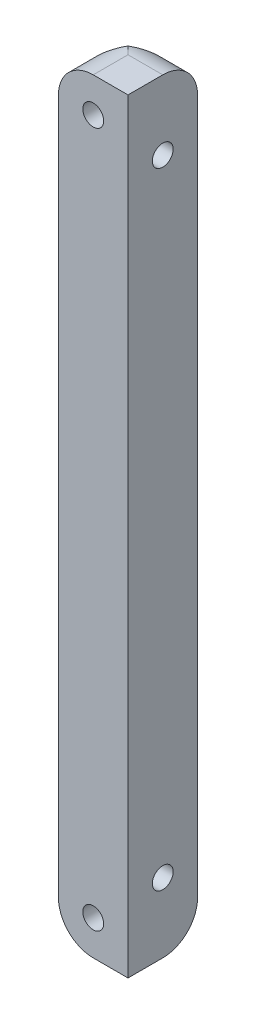
ISO-10303-21;
HEADER;
FILE_DESCRIPTION(('STEP AP214'),'2;1');
FILE_NAME('part.step','',(''),(''),'','','');
FILE_SCHEMA(('AUTOMOTIVE_DESIGN { 1 0 10303 214 1 1 1 1 }'));
ENDSEC;
DATA;
#1=APPLICATION_CONTEXT('core data for automotive mechanical design processes');
#2=APPLICATION_PROTOCOL_DEFINITION('international standard','automotive_design',2000,#1);
#3=PRODUCT_CONTEXT('',#1,'mechanical');
#4=PRODUCT('Part','Part','',(#3));
#5=PRODUCT_RELATED_PRODUCT_CATEGORY('part','',(#4));
#6=PRODUCT_DEFINITION_FORMATION('','',#4);
#7=PRODUCT_DEFINITION_CONTEXT('part definition',#1,'design');
#8=PRODUCT_DEFINITION('design','',#6,#7);
#9=PRODUCT_DEFINITION_SHAPE('','',#8);
#10=(LENGTH_UNIT() NAMED_UNIT(*) SI_UNIT(.MILLI.,.METRE.));
#11=(NAMED_UNIT(*) PLANE_ANGLE_UNIT() SI_UNIT($,.RADIAN.));
#12=(NAMED_UNIT(*) SI_UNIT($,.STERADIAN.) SOLID_ANGLE_UNIT());
#13=UNCERTAINTY_MEASURE_WITH_UNIT(LENGTH_MEASURE(1.E-05),#10,'distance_accuracy_value','');
#14=(GEOMETRIC_REPRESENTATION_CONTEXT(3) GLOBAL_UNCERTAINTY_ASSIGNED_CONTEXT((#13)) GLOBAL_UNIT_ASSIGNED_CONTEXT((#10,
#11,#12)) REPRESENTATION_CONTEXT('',''));
#15=CARTESIAN_POINT('',(0.,0.,0.));
#16=DIRECTION('',(0.,0.,1.));
#17=DIRECTION('',(1.,0.,0.));
#18=AXIS2_PLACEMENT_3D('',#15,#16,#17);
#19=CARTESIAN_POINT('',(0.,0.,12.7));
#20=DIRECTION('',(1.,0.,0.));
#21=DIRECTION('',(0.,0.,-1.));
#22=AXIS2_PLACEMENT_3D('',#19,#20,#21);
#23=PLANE('',#22);
#24=DIRECTION('',(0.,-1.,0.));
#25=VECTOR('',#24,1.);
#26=CARTESIAN_POINT('',(0.,0.,9.52500000000001));
#27=LINE('',#26,#25);
#28=CARTESIAN_POINT('',(0.,133.35,9.52500000000001));
#29=VERTEX_POINT('',#28);
#30=CARTESIAN_POINT('',(0.,6.35,9.52500000000001));
#31=VERTEX_POINT('',#30);
#32=EDGE_CURVE('E163',#29,#31,#27,.T.);
#33=ORIENTED_EDGE('',*,*,#32,.T.);
#34=DIRECTION('',(0.,0.,-1.));
#35=VECTOR('',#34,1.);
#36=CARTESIAN_POINT('',(0.,6.35,12.7));
#37=LINE('',#36,#35);
#38=CARTESIAN_POINT('',(0.,6.35,12.7));
#39=VERTEX_POINT('',#38);
#40=EDGE_CURVE('E226',#31,#39,#37,.F.);
#41=ORIENTED_EDGE('',*,*,#40,.T.);
#42=DIRECTION('',(0.,-1.,0.));
#43=VECTOR('',#42,1.);
#44=CARTESIAN_POINT('',(0.,0.,12.7));
#45=LINE('',#44,#43);
#46=CARTESIAN_POINT('',(0.,133.35,12.7));
#47=VERTEX_POINT('',#46);
#48=EDGE_CURVE('E154',#47,#39,#45,.T.);
#49=ORIENTED_EDGE('',*,*,#48,.F.);
#50=DIRECTION('',(0.,0.,-1.));
#51=VECTOR('',#50,1.);
#52=CARTESIAN_POINT('',(0.,133.35,12.7));
#53=LINE('',#52,#51);
#54=EDGE_CURVE('E223',#47,#29,#53,.T.);
#55=ORIENTED_EDGE('',*,*,#54,.T.);
#56=EDGE_LOOP('',(#33,#41,#49,#55));
#57=FACE_BOUND('',#56,.T.);
#58=ADVANCED_FACE('F47',(#57),#23,.F.);
#59=CARTESIAN_POINT('',(0.,0.,12.7));
#60=DIRECTION('',(0.,1.,0.));
#61=DIRECTION('',(0.,0.,1.));
#62=AXIS2_PLACEMENT_3D('',#59,#60,#61);
#63=PLANE('',#62);
#64=DIRECTION('',(1.,0.,0.));
#65=VECTOR('',#64,1.);
#66=CARTESIAN_POINT('',(0.,0.,12.7));
#67=LINE('',#66,#65);
#68=CARTESIAN_POINT('',(6.35,0.,12.7));
#69=VERTEX_POINT('',#68);
#70=CARTESIAN_POINT('',(12.7,0.,12.7));
#71=VERTEX_POINT('',#70);
#72=EDGE_CURVE('E141',#69,#71,#67,.T.);
#73=ORIENTED_EDGE('',*,*,#72,.F.);
#74=DIRECTION('',(0.,0.,-1.));
#75=VECTOR('',#74,1.);
#76=CARTESIAN_POINT('',(6.35,0.,12.7));
#77=LINE('',#76,#75);
#78=CARTESIAN_POINT('',(6.35,0.,6.35));
#79=VERTEX_POINT('',#78);
#80=EDGE_CURVE('E208',#69,#79,#77,.T.);
#81=ORIENTED_EDGE('',*,*,#80,.T.);
#82=DIRECTION('',(1.,0.,0.));
#83=VECTOR('',#82,1.);
#84=CARTESIAN_POINT('',(12.7,0.,6.35));
#85=LINE('',#84,#83);
#86=CARTESIAN_POINT('',(12.7,0.,6.35));
#87=VERTEX_POINT('',#86);
#88=EDGE_CURVE('E160',#79,#87,#85,.T.);
#89=ORIENTED_EDGE('',*,*,#88,.T.);
#90=DIRECTION('',(0.,0.,-1.));
#91=VECTOR('',#90,1.);
#92=CARTESIAN_POINT('',(12.7,0.,12.7));
#93=LINE('',#92,#91);
#94=EDGE_CURVE('E157',#71,#87,#93,.T.);
#95=ORIENTED_EDGE('',*,*,#94,.F.);
#96=EDGE_LOOP('',(#73,#81,#89,#95));
#97=FACE_BOUND('',#96,.T.);
#98=ADVANCED_FACE('F158',(#97),#63,.F.);
#99=CARTESIAN_POINT('',(12.7,0.,12.7));
#100=DIRECTION('',(-1.,0.,0.));
#101=DIRECTION('',(0.,0.,1.));
#102=AXIS2_PLACEMENT_3D('',#99,#100,#101);
#103=PLANE('',#102);
#104=CARTESIAN_POINT('',(12.7,127.,6.35000000000002));
#105=DIRECTION('',(1.,0.,0.));
#106=DIRECTION('',(0.,0.,-1.));
#107=AXIS2_PLACEMENT_3D('',#104,#105,#106);
#108=CIRCLE('',#107,1.905);
#109=CARTESIAN_POINT('',(12.7,127.,4.44500000000002));
#110=VERTEX_POINT('',#109);
#111=EDGE_CURVE('E201',#110,#110,#108,.T.);
#112=ORIENTED_EDGE('',*,*,#111,.F.);
#113=EDGE_LOOP('',(#112));
#114=FACE_BOUND('',#113,.T.);
#115=CARTESIAN_POINT('',(12.7,12.7,6.35000000000002));
#116=DIRECTION('',(1.,0.,0.));
#117=DIRECTION('',(0.,0.,-1.));
#118=AXIS2_PLACEMENT_3D('',#115,#116,#117);
#119=CIRCLE('',#118,1.905);
#120=CARTESIAN_POINT('',(12.7,12.7,4.44500000000002));
#121=VERTEX_POINT('',#120);
#122=EDGE_CURVE('E248',#121,#121,#119,.T.);
#123=ORIENTED_EDGE('',*,*,#122,.F.);
#124=EDGE_LOOP('',(#123));
#125=FACE_BOUND('',#124,.T.);
#126=ORIENTED_EDGE('',*,*,#94,.T.);
#127=CARTESIAN_POINT('',(12.7,6.35,6.35));
#128=DIRECTION('',(-1.,0.,0.));
#129=DIRECTION('',(0.,0.,1.));
#130=AXIS2_PLACEMENT_3D('',#127,#128,#129);
#131=CIRCLE('',#130,6.35);
#132=CARTESIAN_POINT('',(12.7,6.35,0.));
#133=VERTEX_POINT('',#132);
#134=EDGE_CURVE('E236',#87,#133,#131,.F.);
#135=ORIENTED_EDGE('',*,*,#134,.T.);
#136=DIRECTION('',(0.,1.,0.));
#137=VECTOR('',#136,1.);
#138=CARTESIAN_POINT('',(12.7,0.,0.));
#139=LINE('',#138,#137);
#140=CARTESIAN_POINT('',(12.7,133.35,0.));
#141=VERTEX_POINT('',#140);
#142=EDGE_CURVE('E176',#133,#141,#139,.T.);
#143=ORIENTED_EDGE('',*,*,#142,.T.);
#144=CARTESIAN_POINT('',(12.7,133.35,6.35));
#145=DIRECTION('',(-1.,0.,0.));
#146=DIRECTION('',(0.,0.,1.));
#147=AXIS2_PLACEMENT_3D('',#144,#145,#146);
#148=CIRCLE('',#147,6.35);
#149=CARTESIAN_POINT('',(12.7,139.7,6.35));
#150=VERTEX_POINT('',#149);
#151=EDGE_CURVE('E78',#141,#150,#148,.F.);
#152=ORIENTED_EDGE('',*,*,#151,.T.);
#153=DIRECTION('',(0.,0.,-1.));
#154=VECTOR('',#153,1.);
#155=CARTESIAN_POINT('',(12.7,139.7,12.7));
#156=LINE('',#155,#154);
#157=CARTESIAN_POINT('',(12.7,139.7,12.7));
#158=VERTEX_POINT('',#157);
#159=EDGE_CURVE('E164',#158,#150,#156,.T.);
#160=ORIENTED_EDGE('',*,*,#159,.F.);
#161=DIRECTION('',(0.,1.,0.));
#162=VECTOR('',#161,1.);
#163=CARTESIAN_POINT('',(12.7,0.,12.7));
#164=LINE('',#163,#162);
#165=EDGE_CURVE('E147',#71,#158,#164,.T.);
#166=ORIENTED_EDGE('',*,*,#165,.F.);
#167=EDGE_LOOP('',(#126,#135,#143,#152,#160,#166));
#168=FACE_BOUND('',#167,.T.);
#169=ADVANCED_FACE('F166',(#114,#125,#168),#103,.F.);
#170=CARTESIAN_POINT('',(0.,139.7,12.7));
#171=DIRECTION('',(0.,-1.,0.));
#172=DIRECTION('',(0.,0.,-1.));
#173=AXIS2_PLACEMENT_3D('',#170,#171,#172);
#174=PLANE('',#173);
#175=ORIENTED_EDGE('',*,*,#159,.T.);
#176=DIRECTION('',(-1.,0.,0.));
#177=VECTOR('',#176,1.);
#178=CARTESIAN_POINT('',(9.52500000000004,139.7,6.35));
#179=LINE('',#178,#177);
#180=CARTESIAN_POINT('',(6.35,139.7,6.35));
#181=VERTEX_POINT('',#180);
#182=EDGE_CURVE('E11',#150,#181,#179,.T.);
#183=ORIENTED_EDGE('',*,*,#182,.T.);
#184=DIRECTION('',(0.,0.,-1.));
#185=VECTOR('',#184,1.);
#186=CARTESIAN_POINT('',(6.35,139.7,12.7));
#187=LINE('',#186,#185);
#188=CARTESIAN_POINT('',(6.35,139.7,12.7));
#189=VERTEX_POINT('',#188);
#190=EDGE_CURVE('E57',#181,#189,#187,.F.);
#191=ORIENTED_EDGE('',*,*,#190,.T.);
#192=DIRECTION('',(-1.,0.,0.));
#193=VECTOR('',#192,1.);
#194=CARTESIAN_POINT('',(0.,139.7,12.7));
#195=LINE('',#194,#193);
#196=EDGE_CURVE('E169',#158,#189,#195,.T.);
#197=ORIENTED_EDGE('',*,*,#196,.F.);
#198=EDGE_LOOP('',(#175,#183,#191,#197));
#199=FACE_BOUND('',#198,.T.);
#200=ADVANCED_FACE('F290',(#199),#174,.F.);
#201=CARTESIAN_POINT('',(0.,0.,12.7));
#202=DIRECTION('',(0.,0.,-1.));
#203=DIRECTION('',(-1.,0.,0.));
#204=AXIS2_PLACEMENT_3D('',#201,#202,#203);
#205=PLANE('',#204);
#206=CARTESIAN_POINT('',(6.35,133.35,12.7));
#207=DIRECTION('',(0.,0.,1.));
#208=DIRECTION('',(1.,0.,0.));
#209=AXIS2_PLACEMENT_3D('',#206,#207,#208);
#210=CIRCLE('',#209,1.90499999999999);
#211=CARTESIAN_POINT('',(8.255,133.35,12.7));
#212=VERTEX_POINT('',#211);
#213=EDGE_CURVE('E192',#212,#212,#210,.T.);
#214=ORIENTED_EDGE('',*,*,#213,.F.);
#215=EDGE_LOOP('',(#214));
#216=FACE_BOUND('',#215,.T.);
#217=CARTESIAN_POINT('',(6.35,6.35,12.7));
#218=DIRECTION('',(0.,0.,1.));
#219=DIRECTION('',(1.,0.,0.));
#220=AXIS2_PLACEMENT_3D('',#217,#218,#219);
#221=CIRCLE('',#220,1.905);
#222=CARTESIAN_POINT('',(8.255,6.35,12.7));
#223=VERTEX_POINT('',#222);
#224=EDGE_CURVE('E205',#223,#223,#221,.T.);
#225=ORIENTED_EDGE('',*,*,#224,.F.);
#226=EDGE_LOOP('',(#225));
#227=FACE_BOUND('',#226,.T.);
#228=ORIENTED_EDGE('',*,*,#48,.T.);
#229=CARTESIAN_POINT('',(6.35,6.35,12.7));
#230=DIRECTION('',(0.,0.,-1.));
#231=DIRECTION('',(-1.,0.,0.));
#232=AXIS2_PLACEMENT_3D('',#229,#230,#231);
#233=CIRCLE('',#232,6.35);
#234=EDGE_CURVE('E149',#39,#69,#233,.F.);
#235=ORIENTED_EDGE('',*,*,#234,.T.);
#236=ORIENTED_EDGE('',*,*,#72,.T.);
#237=ORIENTED_EDGE('',*,*,#165,.T.);
#238=ORIENTED_EDGE('',*,*,#196,.T.);
#239=CARTESIAN_POINT('',(6.35,133.35,12.7));
#240=DIRECTION('',(0.,0.,-1.));
#241=DIRECTION('',(-1.,0.,0.));
#242=AXIS2_PLACEMENT_3D('',#239,#240,#241);
#243=CIRCLE('',#242,6.35);
#244=EDGE_CURVE('E229',#189,#47,#243,.F.);
#245=ORIENTED_EDGE('',*,*,#244,.T.);
#246=EDGE_LOOP('',(#228,#235,#236,#237,#238,#245));
#247=FACE_BOUND('',#246,.T.);
#248=ADVANCED_FACE('F144',(#216,#227,#247),#205,.F.);
#249=CARTESIAN_POINT('',(0.,0.,0.));
#250=DIRECTION('',(0.,0.,-1.));
#251=DIRECTION('',(-1.,0.,0.));
#252=AXIS2_PLACEMENT_3D('',#249,#250,#251);
#253=PLANE('',#252);
#254=ORIENTED_EDGE('',*,*,#142,.F.);
#255=DIRECTION('',(1.,0.,0.));
#256=VECTOR('',#255,1.);
#257=CARTESIAN_POINT('',(9.52500000000004,6.35,0.));
#258=LINE('',#257,#256);
#259=CARTESIAN_POINT('',(9.52500000000004,6.34999999999999,0.));
#260=VERTEX_POINT('',#259);
#261=EDGE_CURVE('E242',#133,#260,#258,.F.);
#262=ORIENTED_EDGE('',*,*,#261,.T.);
#263=DIRECTION('',(0.,1.,0.));
#264=VECTOR('',#263,1.);
#265=CARTESIAN_POINT('',(9.52500000000004,139.7,0.));
#266=LINE('',#265,#264);
#267=CARTESIAN_POINT('',(9.52500000000004,133.35,0.));
#268=VERTEX_POINT('',#267);
#269=EDGE_CURVE('E184',#260,#268,#266,.T.);
#270=ORIENTED_EDGE('',*,*,#269,.T.);
#271=DIRECTION('',(-1.,0.,0.));
#272=VECTOR('',#271,1.);
#273=CARTESIAN_POINT('',(12.7,133.35,0.));
#274=LINE('',#273,#272);
#275=EDGE_CURVE('E239',#268,#141,#274,.F.);
#276=ORIENTED_EDGE('',*,*,#275,.T.);
#277=EDGE_LOOP('',(#254,#262,#270,#276));
#278=FACE_BOUND('',#277,.T.);
#279=ADVANCED_FACE('F285',(#278),#253,.T.);
#280=CARTESIAN_POINT('',(0.,0.,9.52500000000001));
#281=DIRECTION('',(-0.707106781186546,0.,-0.707106781186549));
#282=DIRECTION('',(0.,1.,0.));
#283=AXIS2_PLACEMENT_3D('',#280,#281,#282);
#284=PLANE('',#283);
#285=CARTESIAN_POINT('',(3.175,127.,6.35000000000002));
#286=DIRECTION('',(-0.707106781186546,0.,-0.707106781186549));
#287=DIRECTION('',(0.707106781186549,0.,-0.707106781186546));
#288=AXIS2_PLACEMENT_3D('',#285,#286,#287);
#289=ELLIPSE('',#288,2.69407683632075,1.905);
#290=CARTESIAN_POINT('',(5.08,127.,4.44500000000002));
#291=VERTEX_POINT('',#290);
#292=EDGE_CURVE('E200',#291,#291,#289,.T.);
#293=ORIENTED_EDGE('',*,*,#292,.F.);
#294=EDGE_LOOP('',(#293));
#295=FACE_BOUND('',#294,.T.);
#296=CARTESIAN_POINT('',(3.175,12.7,6.35000000000002));
#297=DIRECTION('',(-0.707106781186546,0.,-0.707106781186549));
#298=DIRECTION('',(0.707106781186549,0.,-0.707106781186546));
#299=AXIS2_PLACEMENT_3D('',#296,#297,#298);
#300=ELLIPSE('',#299,2.69407683632075,1.905);
#301=CARTESIAN_POINT('',(5.08000000000001,12.7,4.44500000000002));
#302=VERTEX_POINT('',#301);
#303=EDGE_CURVE('E196',#302,#302,#300,.T.);
#304=ORIENTED_EDGE('',*,*,#303,.F.);
#305=EDGE_LOOP('',(#304));
#306=FACE_BOUND('',#305,.T.);
#307=CARTESIAN_POINT('',(6.35,133.35,3.17500000000003));
#308=DIRECTION('',(-0.707106781186546,0.,-0.707106781186549));
#309=DIRECTION('',(-0.707106781186549,0.,0.707106781186546));
#310=AXIS2_PLACEMENT_3D('',#307,#308,#309);
#311=ELLIPSE('',#310,2.69407683632073,1.90499999999999);
#312=CARTESIAN_POINT('',(4.445,133.35,5.08000000000002));
#313=VERTEX_POINT('',#312);
#314=EDGE_CURVE('E178',#313,#313,#311,.T.);
#315=ORIENTED_EDGE('',*,*,#314,.F.);
#316=EDGE_LOOP('',(#315));
#317=FACE_BOUND('',#316,.T.);
#318=CARTESIAN_POINT('',(6.35,6.35,3.17500000000003));
#319=DIRECTION('',(-0.707106781186546,0.,-0.707106781186549));
#320=DIRECTION('',(-0.707106781186549,0.,0.707106781186546));
#321=AXIS2_PLACEMENT_3D('',#318,#319,#320);
#322=ELLIPSE('',#321,2.69407683632074,1.905);
#323=CARTESIAN_POINT('',(4.445,6.35,5.08000000000003));
#324=VERTEX_POINT('',#323);
#325=EDGE_CURVE('E188',#324,#324,#322,.T.);
#326=ORIENTED_EDGE('',*,*,#325,.F.);
#327=EDGE_LOOP('',(#326));
#328=FACE_BOUND('',#327,.T.);
#329=CARTESIAN_POINT('',(3.17500000000002,6.35,6.35));
#330=DIRECTION('',(-0.707106781186546,0.,-0.707106781186549));
#331=DIRECTION('',(-0.707106781186549,0.,0.707106781186546));
#332=AXIS2_PLACEMENT_3D('',#329,#330,#331);
#333=ELLIPSE('',#332,8.98025612106917,6.35);
#334=CARTESIAN_POINT('',(4.76250000000001,0.201638937895723,4.76250000000001));
#335=VERTEX_POINT('',#334);
#336=EDGE_CURVE('E217',#260,#335,#333,.T.);
#337=ORIENTED_EDGE('',*,*,#336,.T.);
#338=CARTESIAN_POINT('',(6.35,6.35,3.17500000000003));
#339=DIRECTION('',(-0.707106781186546,0.,-0.707106781186549));
#340=DIRECTION('',(0.707106781186549,0.,-0.707106781186546));
#341=AXIS2_PLACEMENT_3D('',#338,#339,#340);
#342=ELLIPSE('',#341,8.98025612106914,6.35);
#343=EDGE_CURVE('E220',#335,#31,#342,.T.);
#344=ORIENTED_EDGE('',*,*,#343,.T.);
#345=ORIENTED_EDGE('',*,*,#32,.F.);
#346=CARTESIAN_POINT('',(6.35,133.35,3.17500000000003));
#347=DIRECTION('',(-0.707106781186546,0.,-0.707106781186549));
#348=DIRECTION('',(0.707106781186549,0.,-0.707106781186546));
#349=AXIS2_PLACEMENT_3D('',#346,#347,#348);
#350=ELLIPSE('',#349,8.98025612106914,6.35);
#351=CARTESIAN_POINT('',(4.76250000000001,139.498361062104,4.76250000000001));
#352=VERTEX_POINT('',#351);
#353=EDGE_CURVE('E211',#29,#352,#350,.T.);
#354=ORIENTED_EDGE('',*,*,#353,.T.);
#355=CARTESIAN_POINT('',(3.17500000000002,133.35,6.35));
#356=DIRECTION('',(-0.707106781186546,0.,-0.707106781186549));
#357=DIRECTION('',(0.707106781186549,0.,-0.707106781186546));
#358=AXIS2_PLACEMENT_3D('',#355,#356,#357);
#359=ELLIPSE('',#358,8.98025612106917,6.35);
#360=EDGE_CURVE('E214',#352,#268,#359,.T.);
#361=ORIENTED_EDGE('',*,*,#360,.T.);
#362=ORIENTED_EDGE('',*,*,#269,.F.);
#363=EDGE_LOOP('',(#337,#344,#345,#354,#361,#362));
#364=FACE_BOUND('',#363,.T.);
#365=ADVANCED_FACE('F277',(#295,#306,#317,#328,#364),#284,.T.);
#366=CARTESIAN_POINT('',(6.35,6.35,0.));
#367=DIRECTION('',(0.,0.,1.));
#368=DIRECTION('',(1.,0.,0.));
#369=AXIS2_PLACEMENT_3D('',#366,#367,#368);
#370=CYLINDRICAL_SURFACE('',#369,1.905);
#371=ORIENTED_EDGE('',*,*,#325,.T.);
#372=EDGE_LOOP('',(#371));
#373=FACE_BOUND('',#372,.T.);
#374=ORIENTED_EDGE('',*,*,#224,.T.);
#375=EDGE_LOOP('',(#374));
#376=FACE_BOUND('',#375,.T.);
#377=ADVANCED_FACE('F317',(#373,#376),#370,.F.);
#378=CARTESIAN_POINT('',(6.35,133.35,0.));
#379=DIRECTION('',(0.,0.,1.));
#380=DIRECTION('',(1.,0.,0.));
#381=AXIS2_PLACEMENT_3D('',#378,#379,#380);
#382=CYLINDRICAL_SURFACE('',#381,1.90499999999999);
#383=ORIENTED_EDGE('',*,*,#314,.T.);
#384=EDGE_LOOP('',(#383));
#385=FACE_BOUND('',#384,.T.);
#386=ORIENTED_EDGE('',*,*,#213,.T.);
#387=EDGE_LOOP('',(#386));
#388=FACE_BOUND('',#387,.T.);
#389=ADVANCED_FACE('F397',(#385,#388),#382,.F.);
#390=CARTESIAN_POINT('',(0.,12.7,6.35000000000002));
#391=DIRECTION('',(1.,0.,0.));
#392=DIRECTION('',(0.,0.,-1.));
#393=AXIS2_PLACEMENT_3D('',#390,#391,#392);
#394=CYLINDRICAL_SURFACE('',#393,1.905);
#395=ORIENTED_EDGE('',*,*,#303,.T.);
#396=EDGE_LOOP('',(#395));
#397=FACE_BOUND('',#396,.T.);
#398=ORIENTED_EDGE('',*,*,#122,.T.);
#399=EDGE_LOOP('',(#398));
#400=FACE_BOUND('',#399,.T.);
#401=ADVANCED_FACE('F388',(#397,#400),#394,.F.);
#402=CARTESIAN_POINT('',(0.,127.,6.35000000000002));
#403=DIRECTION('',(1.,0.,0.));
#404=DIRECTION('',(0.,0.,-1.));
#405=AXIS2_PLACEMENT_3D('',#402,#403,#404);
#406=CYLINDRICAL_SURFACE('',#405,1.905);
#407=ORIENTED_EDGE('',*,*,#292,.T.);
#408=EDGE_LOOP('',(#407));
#409=FACE_BOUND('',#408,.T.);
#410=ORIENTED_EDGE('',*,*,#111,.T.);
#411=EDGE_LOOP('',(#410));
#412=FACE_BOUND('',#411,.T.);
#413=ADVANCED_FACE('F322',(#409,#412),#406,.F.);
#414=CARTESIAN_POINT('',(0.,6.35,6.35));
#415=DIRECTION('',(-1.,0.,0.));
#416=DIRECTION('',(0.,0.,1.));
#417=AXIS2_PLACEMENT_3D('',#414,#415,#416);
#418=CYLINDRICAL_SURFACE('',#417,6.35);
#419=ORIENTED_EDGE('',*,*,#134,.F.);
#420=ORIENTED_EDGE('',*,*,#88,.F.);
#421=CARTESIAN_POINT('',(6.35,6.35,6.35));
#422=DIRECTION('',(-0.707106781186547,0.,0.707106781186547));
#423=DIRECTION('',(-0.707106781186547,0.,-0.707106781186547));
#424=AXIS2_PLACEMENT_3D('',#421,#422,#423);
#425=ELLIPSE('',#424,8.98025612106915,6.35);
#426=EDGE_CURVE('E246',#335,#79,#425,.T.);
#427=ORIENTED_EDGE('',*,*,#426,.F.);
#428=ORIENTED_EDGE('',*,*,#336,.F.);
#429=ORIENTED_EDGE('',*,*,#261,.F.);
#430=EDGE_LOOP('',(#419,#420,#427,#428,#429));
#431=FACE_BOUND('',#430,.T.);
#432=ADVANCED_FACE('F288',(#431),#418,.T.);
#433=CARTESIAN_POINT('',(6.35,6.35,12.7));
#434=DIRECTION('',(0.,0.,-1.));
#435=DIRECTION('',(-1.,0.,0.));
#436=AXIS2_PLACEMENT_3D('',#433,#434,#435);
#437=CYLINDRICAL_SURFACE('',#436,6.35);
#438=ORIENTED_EDGE('',*,*,#234,.F.);
#439=ORIENTED_EDGE('',*,*,#40,.F.);
#440=ORIENTED_EDGE('',*,*,#343,.F.);
#441=ORIENTED_EDGE('',*,*,#426,.T.);
#442=ORIENTED_EDGE('',*,*,#80,.F.);
#443=EDGE_LOOP('',(#438,#439,#440,#441,#442));
#444=FACE_BOUND('',#443,.T.);
#445=ADVANCED_FACE('F273',(#444),#437,.T.);
#446=CARTESIAN_POINT('',(6.35,133.35,12.7));
#447=DIRECTION('',(0.,0.,-1.));
#448=DIRECTION('',(-1.,0.,0.));
#449=AXIS2_PLACEMENT_3D('',#446,#447,#448);
#450=CYLINDRICAL_SURFACE('',#449,6.35);
#451=ORIENTED_EDGE('',*,*,#244,.F.);
#452=ORIENTED_EDGE('',*,*,#190,.F.);
#453=CARTESIAN_POINT('',(6.35,133.35,6.35));
#454=DIRECTION('',(0.707106781186547,0.,-0.707106781186547));
#455=DIRECTION('',(-0.707106781186547,0.,-0.707106781186547));
#456=AXIS2_PLACEMENT_3D('',#453,#454,#455);
#457=ELLIPSE('',#456,8.98025612106915,6.35);
#458=EDGE_CURVE('E51',#352,#181,#457,.T.);
#459=ORIENTED_EDGE('',*,*,#458,.F.);
#460=ORIENTED_EDGE('',*,*,#353,.F.);
#461=ORIENTED_EDGE('',*,*,#54,.F.);
#462=EDGE_LOOP('',(#451,#452,#459,#460,#461));
#463=FACE_BOUND('',#462,.T.);
#464=ADVANCED_FACE('F49',(#463),#450,.T.);
#465=CARTESIAN_POINT('',(0.,133.35,6.35));
#466=DIRECTION('',(1.,0.,0.));
#467=DIRECTION('',(0.,0.,-1.));
#468=AXIS2_PLACEMENT_3D('',#465,#466,#467);
#469=CYLINDRICAL_SURFACE('',#468,6.35);
#470=ORIENTED_EDGE('',*,*,#151,.F.);
#471=ORIENTED_EDGE('',*,*,#275,.F.);
#472=ORIENTED_EDGE('',*,*,#360,.F.);
#473=ORIENTED_EDGE('',*,*,#458,.T.);
#474=ORIENTED_EDGE('',*,*,#182,.F.);
#475=EDGE_LOOP('',(#470,#471,#472,#473,#474));
#476=FACE_BOUND('',#475,.T.);
#477=ADVANCED_FACE('F280',(#476),#469,.T.);
#478=CLOSED_SHELL('',(#58,#98,#169,#200,#248,#279,#365,#377,#389,#401,#413,#432,#445,#464,#477));
#479=MANIFOLD_SOLID_BREP('B2',#478);
#480=ADVANCED_BREP_SHAPE_REPRESENTATION('',(#18,#479),#14);
#481=SHAPE_DEFINITION_REPRESENTATION(#9,#480);
ENDSEC;
END-ISO-10303-21;
